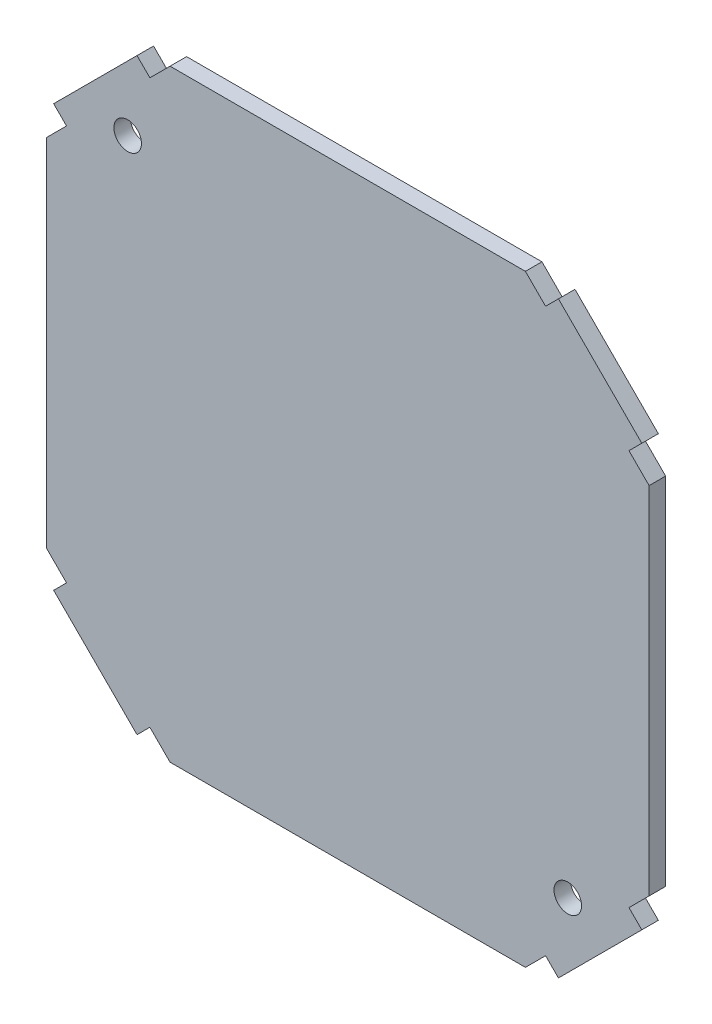
ISO-10303-21;
HEADER;
FILE_DESCRIPTION(('STEP AP214'),'2;1');
FILE_NAME('part.step','',(''),(''),'','','');
FILE_SCHEMA(('AUTOMOTIVE_DESIGN { 1 0 10303 214 1 1 1 1 }'));
ENDSEC;
DATA;
#1=APPLICATION_CONTEXT('core data for automotive mechanical design processes');
#2=APPLICATION_PROTOCOL_DEFINITION('international standard','automotive_design',2000,#1);
#3=PRODUCT_CONTEXT('',#1,'mechanical');
#4=PRODUCT('Part','Part','',(#3));
#5=PRODUCT_RELATED_PRODUCT_CATEGORY('part','',(#4));
#6=PRODUCT_DEFINITION_FORMATION('','',#4);
#7=PRODUCT_DEFINITION_CONTEXT('part definition',#1,'design');
#8=PRODUCT_DEFINITION('design','',#6,#7);
#9=PRODUCT_DEFINITION_SHAPE('','',#8);
#10=(LENGTH_UNIT() NAMED_UNIT(*) SI_UNIT(.MILLI.,.METRE.));
#11=(NAMED_UNIT(*) PLANE_ANGLE_UNIT() SI_UNIT($,.RADIAN.));
#12=(NAMED_UNIT(*) SI_UNIT($,.STERADIAN.) SOLID_ANGLE_UNIT());
#13=UNCERTAINTY_MEASURE_WITH_UNIT(LENGTH_MEASURE(1.E-05),#10,'distance_accuracy_value','');
#14=(GEOMETRIC_REPRESENTATION_CONTEXT(3) GLOBAL_UNCERTAINTY_ASSIGNED_CONTEXT((#13)) GLOBAL_UNIT_ASSIGNED_CONTEXT((#10,
#11,#12)) REPRESENTATION_CONTEXT('',''));
#15=CARTESIAN_POINT('',(0.,0.,0.));
#16=DIRECTION('',(0.,0.,1.));
#17=DIRECTION('',(1.,0.,0.));
#18=AXIS2_PLACEMENT_3D('',#15,#16,#17);
#19=CARTESIAN_POINT('',(-28.2067734002126,28.2067734002128,-154.714963723617));
#20=DIRECTION('',(-0.707106781186546,0.707106781186549,0.));
#21=DIRECTION('',(-0.707106781186549,-0.707106781186546,0.));
#22=AXIS2_PLACEMENT_3D('',#19,#20,#21);
#23=PLANE('',#22);
#24=DIRECTION('',(0.707106781186549,0.707106781186546,0.));
#25=VECTOR('',#24,1.);
#26=CARTESIAN_POINT('',(-28.2067734002126,28.2067734002128,0.));
#27=LINE('',#26,#25);
#28=CARTESIAN_POINT('',(-6.10109758405818,50.3124492163671,0.));
#29=VERTEX_POINT('',#28);
#30=CARTESIAN_POINT('',(-2.44129960941351,53.9722471910118,0.));
#31=VERTEX_POINT('',#30);
#32=EDGE_CURVE('E141',#29,#31,#27,.T.);
#33=ORIENTED_EDGE('',*,*,#32,.F.);
#34=DIRECTION('',(0.,0.,1.));
#35=VECTOR('',#34,1.);
#36=CARTESIAN_POINT('',(-6.10109758405818,50.3124492163671,-154.714963723617));
#37=LINE('',#36,#35);
#38=CARTESIAN_POINT('',(-6.10109758405818,50.3124492163671,3.));
#39=VERTEX_POINT('',#38);
#40=EDGE_CURVE('E316',#29,#39,#37,.T.);
#41=ORIENTED_EDGE('',*,*,#40,.T.);
#42=DIRECTION('',(-0.707106781186549,-0.707106781186546,0.));
#43=VECTOR('',#42,1.);
#44=CARTESIAN_POINT('',(-28.2067734002126,28.2067734002128,3.));
#45=LINE('',#44,#43);
#46=CARTESIAN_POINT('',(-2.44129960941351,53.9722471910118,3.));
#47=VERTEX_POINT('',#46);
#48=EDGE_CURVE('E310',#47,#39,#45,.T.);
#49=ORIENTED_EDGE('',*,*,#48,.F.);
#50=DIRECTION('',(0.,0.,1.));
#51=VECTOR('',#50,1.);
#52=CARTESIAN_POINT('',(-2.44129960941351,53.9722471910118,-154.714963723617));
#53=LINE('',#52,#51);
#54=EDGE_CURVE('E313',#31,#47,#53,.T.);
#55=ORIENTED_EDGE('',*,*,#54,.F.);
#56=EDGE_LOOP('',(#33,#41,#49,#55));
#57=FACE_BOUND('',#56,.T.);
#58=ADVANCED_FACE('F39',(#57),#23,.T.);
#59=CARTESIAN_POINT('',(0.,53.9722471910118,-154.714963723617));
#60=DIRECTION('',(0.,1.,0.));
#61=DIRECTION('',(-1.,0.,0.));
#62=AXIS2_PLACEMENT_3D('',#59,#60,#61);
#63=PLANE('',#62);
#64=DIRECTION('',(1.,0.,0.));
#65=VECTOR('',#64,1.);
#66=CARTESIAN_POINT('',(0.,53.9722471910118,0.));
#67=LINE('',#66,#65);
#68=CARTESIAN_POINT('',(62.0553382572235,53.9722471910117,0.));
#69=VERTEX_POINT('',#68);
#70=EDGE_CURVE('E348',#31,#69,#67,.T.);
#71=ORIENTED_EDGE('',*,*,#70,.F.);
#72=ORIENTED_EDGE('',*,*,#54,.T.);
#73=DIRECTION('',(-1.,0.,0.));
#74=VECTOR('',#73,1.);
#75=CARTESIAN_POINT('',(0.,53.9722471910118,3.));
#76=LINE('',#75,#74);
#77=CARTESIAN_POINT('',(62.0553382572235,53.9722471910117,3.));
#78=VERTEX_POINT('',#77);
#79=EDGE_CURVE('E238',#78,#47,#76,.T.);
#80=ORIENTED_EDGE('',*,*,#79,.F.);
#81=DIRECTION('',(0.,0.,1.));
#82=VECTOR('',#81,1.);
#83=CARTESIAN_POINT('',(62.0553382572235,53.9722471910117,-154.714963723617));
#84=LINE('',#83,#82);
#85=EDGE_CURVE('E315',#69,#78,#84,.T.);
#86=ORIENTED_EDGE('',*,*,#85,.F.);
#87=EDGE_LOOP('',(#71,#72,#80,#86));
#88=FACE_BOUND('',#87,.T.);
#89=ADVANCED_FACE('F406',(#88),#63,.T.);
#90=CARTESIAN_POINT('',(58.0137927241175,58.0137927241177,-154.714963723617));
#91=DIRECTION('',(0.707106781186546,0.707106781186549,0.));
#92=DIRECTION('',(-0.707106781186549,0.707106781186546,0.));
#93=AXIS2_PLACEMENT_3D('',#90,#91,#92);
#94=PLANE('',#93);
#95=DIRECTION('',(0.707106781186549,-0.707106781186546,0.));
#96=VECTOR('',#95,1.);
#97=CARTESIAN_POINT('',(58.0137927241175,58.0137927241177,0.));
#98=LINE('',#97,#96);
#99=CARTESIAN_POINT('',(65.7151362318668,50.3124492163724,0.));
#100=VERTEX_POINT('',#99);
#101=EDGE_CURVE('E350',#69,#100,#98,.T.);
#102=ORIENTED_EDGE('',*,*,#101,.F.);
#103=ORIENTED_EDGE('',*,*,#85,.T.);
#104=DIRECTION('',(-0.707106781186549,0.707106781186546,0.));
#105=VECTOR('',#104,1.);
#106=CARTESIAN_POINT('',(58.0137927241175,58.0137927241177,3.));
#107=LINE('',#106,#105);
#108=CARTESIAN_POINT('',(65.7151362318668,50.3124492163724,3.));
#109=VERTEX_POINT('',#108);
#110=EDGE_CURVE('E241',#109,#78,#107,.T.);
#111=ORIENTED_EDGE('',*,*,#110,.F.);
#112=DIRECTION('',(0.,0.,1.));
#113=VECTOR('',#112,1.);
#114=CARTESIAN_POINT('',(65.7151362318668,50.3124492163724,-154.714963723617));
#115=LINE('',#114,#113);
#116=EDGE_CURVE('E246',#100,#109,#115,.T.);
#117=ORIENTED_EDGE('',*,*,#116,.F.);
#118=EDGE_LOOP('',(#102,#103,#111,#117));
#119=FACE_BOUND('',#118,.T.);
#120=ADVANCED_FACE('F412',(#119),#94,.T.);
#121=CARTESIAN_POINT('',(7.70134350774698,-7.70134350774703,-154.714963723617));
#122=DIRECTION('',(0.707106781186546,-0.70710678118655,0.));
#123=DIRECTION('',(0.70710678118655,0.707106781186546,0.));
#124=AXIS2_PLACEMENT_3D('',#121,#122,#123);
#125=PLANE('',#124);
#126=DIRECTION('',(0.,0.,1.));
#127=VECTOR('',#126,1.);
#128=CARTESIAN_POINT('',(68.0485886097844,52.64590159429,-154.714963723617));
#129=LINE('',#128,#127);
#130=CARTESIAN_POINT('',(68.0485886097844,52.64590159429,0.));
#131=VERTEX_POINT('',#130);
#132=CARTESIAN_POINT('',(68.0485886097844,52.64590159429,3.));
#133=VERTEX_POINT('',#132);
#134=EDGE_CURVE('E251',#131,#133,#129,.T.);
#135=ORIENTED_EDGE('',*,*,#134,.F.);
#136=DIRECTION('',(-0.70710678118655,-0.707106781186546,0.));
#137=VECTOR('',#136,1.);
#138=CARTESIAN_POINT('',(7.70134350774698,-7.70134350774703,0.));
#139=LINE('',#138,#137);
#140=EDGE_CURVE('E318',#131,#100,#139,.T.);
#141=ORIENTED_EDGE('',*,*,#140,.T.);
#142=ORIENTED_EDGE('',*,*,#116,.T.);
#143=DIRECTION('',(0.70710678118655,0.707106781186546,0.));
#144=VECTOR('',#143,1.);
#145=CARTESIAN_POINT('',(7.70134350774698,-7.70134350774703,3.));
#146=LINE('',#145,#144);
#147=EDGE_CURVE('E242',#109,#133,#146,.T.);
#148=ORIENTED_EDGE('',*,*,#147,.T.);
#149=EDGE_LOOP('',(#135,#141,#142,#148));
#150=FACE_BOUND('',#149,.T.);
#151=ADVANCED_FACE('F416',(#150),#125,.F.);
#152=CARTESIAN_POINT('',(60.3472451020374,60.347245102037,-154.714963723617));
#153=DIRECTION('',(-0.70710678118655,-0.707106781186545,0.));
#154=DIRECTION('',(0.707106781186545,-0.70710678118655,0.));
#155=AXIS2_PLACEMENT_3D('',#152,#153,#154);
#156=PLANE('',#155);
#157=DIRECTION('',(0.,0.,1.));
#158=VECTOR('',#157,1.);
#159=CARTESIAN_POINT('',(83.1806737271765,37.5138164768978,-154.714963723617));
#160=LINE('',#159,#158);
#161=CARTESIAN_POINT('',(83.1806737271765,37.5138164768978,0.));
#162=VERTEX_POINT('',#161);
#163=CARTESIAN_POINT('',(83.1806737271765,37.5138164768978,3.));
#164=VERTEX_POINT('',#163);
#165=EDGE_CURVE('E256',#162,#164,#160,.T.);
#166=ORIENTED_EDGE('',*,*,#165,.F.);
#167=DIRECTION('',(-0.707106781186545,0.70710678118655,0.));
#168=VECTOR('',#167,1.);
#169=CARTESIAN_POINT('',(60.3472451020374,60.347245102037,0.));
#170=LINE('',#169,#168);
#171=EDGE_CURVE('E245',#162,#131,#170,.T.);
#172=ORIENTED_EDGE('',*,*,#171,.T.);
#173=ORIENTED_EDGE('',*,*,#134,.T.);
#174=DIRECTION('',(0.707106781186545,-0.70710678118655,0.));
#175=VECTOR('',#174,1.);
#176=CARTESIAN_POINT('',(60.3472451020374,60.347245102037,3.));
#177=LINE('',#176,#175);
#178=EDGE_CURVE('E247',#133,#164,#177,.T.);
#179=ORIENTED_EDGE('',*,*,#178,.T.);
#180=EDGE_LOOP('',(#166,#172,#173,#179));
#181=FACE_BOUND('',#180,.T.);
#182=ADVANCED_FACE('F420',(#181),#156,.F.);
#183=CARTESIAN_POINT('',(22.8334286251391,-22.8334286251392,-154.714963723617));
#184=DIRECTION('',(-0.707106781186546,0.70710678118655,0.));
#185=DIRECTION('',(-0.70710678118655,-0.707106781186546,0.));
#186=AXIS2_PLACEMENT_3D('',#183,#184,#185);
#187=PLANE('',#186);
#188=DIRECTION('',(0.,0.,1.));
#189=VECTOR('',#188,1.);
#190=CARTESIAN_POINT('',(80.8472213492589,35.1803640989803,-154.714963723617));
#191=LINE('',#190,#189);
#192=CARTESIAN_POINT('',(80.847221349257,35.1803640989783,0.));
#193=VERTEX_POINT('',#192);
#194=CARTESIAN_POINT('',(80.8472213492589,35.1803640989803,3.));
#195=VERTEX_POINT('',#194);
#196=EDGE_CURVE('E255',#193,#195,#191,.T.);
#197=ORIENTED_EDGE('',*,*,#196,.F.);
#198=DIRECTION('',(0.70710678118655,0.707106781186546,0.));
#199=VECTOR('',#198,1.);
#200=CARTESIAN_POINT('',(22.8334286251391,-22.8334286251392,0.));
#201=LINE('',#200,#199);
#202=EDGE_CURVE('E250',#193,#162,#201,.T.);
#203=ORIENTED_EDGE('',*,*,#202,.T.);
#204=ORIENTED_EDGE('',*,*,#165,.T.);
#205=DIRECTION('',(-0.70710678118655,-0.707106781186546,0.));
#206=VECTOR('',#205,1.);
#207=CARTESIAN_POINT('',(22.8334286251391,-22.8334286251392,3.));
#208=LINE('',#207,#206);
#209=EDGE_CURVE('E252',#164,#195,#208,.T.);
#210=ORIENTED_EDGE('',*,*,#209,.T.);
#211=EDGE_LOOP('',(#197,#203,#204,#210));
#212=FACE_BOUND('',#211,.T.);
#213=ADVANCED_FACE('F425',(#212),#187,.F.);
#214=DIRECTION('',(0.707106781186549,-0.707106781186546,0.));
#215=VECTOR('',#214,1.);
#216=CARTESIAN_POINT('',(58.0137927241175,58.0137927241177,0.));
#217=LINE('',#216,#215);
#218=CARTESIAN_POINT('',(84.507019323905,31.5205661243303,0.));
#219=VERTEX_POINT('',#218);
#220=EDGE_CURVE('E352',#193,#219,#217,.T.);
#221=ORIENTED_EDGE('',*,*,#220,.F.);
#222=ORIENTED_EDGE('',*,*,#196,.T.);
#223=CARTESIAN_POINT('',(84.507019323905,31.5205661243303,3.));
#224=VERTEX_POINT('',#223);
#225=EDGE_CURVE('E257',#224,#195,#107,.T.);
#226=ORIENTED_EDGE('',*,*,#225,.F.);
#227=DIRECTION('',(0.,0.,1.));
#228=VECTOR('',#227,1.);
#229=CARTESIAN_POINT('',(84.507019323905,31.5205661243303,-154.714963723617));
#230=LINE('',#229,#228);
#231=EDGE_CURVE('E323',#219,#224,#230,.T.);
#232=ORIENTED_EDGE('',*,*,#231,.F.);
#233=EDGE_LOOP('',(#221,#222,#226,#232));
#234=FACE_BOUND('',#233,.T.);
#235=ADVANCED_FACE('F429',(#234),#94,.T.);
#236=CARTESIAN_POINT('',(84.507019323905,0.,-154.714963723617));
#237=DIRECTION('',(1.,0.,0.));
#238=DIRECTION('',(0.,0.,-1.));
#239=AXIS2_PLACEMENT_3D('',#236,#237,#238);
#240=PLANE('',#239);
#241=DIRECTION('',(0.,-1.,0.));
#242=VECTOR('',#241,1.);
#243=CARTESIAN_POINT('',(84.507019323905,0.,0.));
#244=LINE('',#243,#242);
#245=CARTESIAN_POINT('',(84.507019323905,-32.9760717423068,0.));
#246=VERTEX_POINT('',#245);
#247=EDGE_CURVE('E360',#219,#246,#244,.T.);
#248=ORIENTED_EDGE('',*,*,#247,.F.);
#249=ORIENTED_EDGE('',*,*,#231,.T.);
#250=DIRECTION('',(0.,1.,0.));
#251=VECTOR('',#250,1.);
#252=CARTESIAN_POINT('',(84.507019323905,0.,3.));
#253=LINE('',#252,#251);
#254=CARTESIAN_POINT('',(84.507019323905,-32.9760717423068,3.));
#255=VERTEX_POINT('',#254);
#256=EDGE_CURVE('E260',#255,#224,#253,.T.);
#257=ORIENTED_EDGE('',*,*,#256,.F.);
#258=DIRECTION('',(0.,0.,1.));
#259=VECTOR('',#258,1.);
#260=CARTESIAN_POINT('',(84.507019323905,-32.9760717423068,-154.714963723617));
#261=LINE('',#260,#259);
#262=EDGE_CURVE('E325',#246,#255,#261,.T.);
#263=ORIENTED_EDGE('',*,*,#262,.F.);
#264=EDGE_LOOP('',(#248,#249,#257,#263));
#265=FACE_BOUND('',#264,.T.);
#266=ADVANCED_FACE('F434',(#265),#240,.T.);
#267=CARTESIAN_POINT('',(58.7415455331057,-58.7415455331059,-154.714963723617));
#268=DIRECTION('',(0.707106781186546,-0.707106781186549,0.));
#269=DIRECTION('',(0.707106781186549,0.707106781186546,0.));
#270=AXIS2_PLACEMENT_3D('',#267,#268,#269);
#271=PLANE('',#270);
#272=DIRECTION('',(-0.707106781186549,-0.707106781186546,0.));
#273=VECTOR('',#272,1.);
#274=CARTESIAN_POINT('',(58.7415455331057,-58.7415455331059,0.));
#275=LINE('',#274,#273);
#276=CARTESIAN_POINT('',(80.8472213492677,-36.6358697169445,0.));
#277=VERTEX_POINT('',#276);
#278=EDGE_CURVE('E362',#246,#277,#275,.T.);
#279=ORIENTED_EDGE('',*,*,#278,.F.);
#280=ORIENTED_EDGE('',*,*,#262,.T.);
#281=DIRECTION('',(0.707106781186549,0.707106781186546,0.));
#282=VECTOR('',#281,1.);
#283=CARTESIAN_POINT('',(58.7415455331057,-58.7415455331059,3.));
#284=LINE('',#283,#282);
#285=CARTESIAN_POINT('',(80.8472213492677,-36.6358697169445,3.));
#286=VERTEX_POINT('',#285);
#287=EDGE_CURVE('E263',#286,#255,#284,.T.);
#288=ORIENTED_EDGE('',*,*,#287,.F.);
#289=DIRECTION('',(0.,0.,1.));
#290=VECTOR('',#289,1.);
#291=CARTESIAN_POINT('',(80.8472213492677,-36.6358697169445,-154.714963723617));
#292=LINE('',#291,#290);
#293=EDGE_CURVE('E268',#277,#286,#292,.T.);
#294=ORIENTED_EDGE('',*,*,#293,.F.);
#295=EDGE_LOOP('',(#279,#280,#288,#294));
#296=FACE_BOUND('',#295,.T.);
#297=ADVANCED_FACE('F440',(#296),#271,.T.);
#298=CARTESIAN_POINT('',(22.1056758161625,22.105675816162,-154.714963723617));
#299=DIRECTION('',(-0.707106781186555,-0.70710678118654,0.));
#300=DIRECTION('',(0.70710678118654,-0.707106781186555,0.));
#301=AXIS2_PLACEMENT_3D('',#298,#299,#300);
#302=PLANE('',#301);
#303=DIRECTION('',(0.,0.,1.));
#304=VECTOR('',#303,1.);
#305=CARTESIAN_POINT('',(83.1806737271835,-38.9693220948604,-154.714963723617));
#306=LINE('',#305,#304);
#307=CARTESIAN_POINT('',(83.1806737271835,-38.9693220948604,0.));
#308=VERTEX_POINT('',#307);
#309=CARTESIAN_POINT('',(83.1806737271835,-38.9693220948604,3.));
#310=VERTEX_POINT('',#309);
#311=EDGE_CURVE('E273',#308,#310,#306,.T.);
#312=ORIENTED_EDGE('',*,*,#311,.F.);
#313=DIRECTION('',(-0.70710678118654,0.707106781186555,0.));
#314=VECTOR('',#313,1.);
#315=CARTESIAN_POINT('',(22.1056758161625,22.105675816162,0.));
#316=LINE('',#315,#314);
#317=EDGE_CURVE('E327',#308,#277,#316,.T.);
#318=ORIENTED_EDGE('',*,*,#317,.T.);
#319=ORIENTED_EDGE('',*,*,#293,.T.);
#320=DIRECTION('',(0.70710678118654,-0.707106781186555,0.));
#321=VECTOR('',#320,1.);
#322=CARTESIAN_POINT('',(22.1056758161625,22.105675816162,3.));
#323=LINE('',#322,#321);
#324=EDGE_CURVE('E264',#286,#310,#323,.T.);
#325=ORIENTED_EDGE('',*,*,#324,.T.);
#326=EDGE_LOOP('',(#312,#318,#319,#325));
#327=FACE_BOUND('',#326,.T.);
#328=ADVANCED_FACE('F444',(#327),#302,.F.);
#329=CARTESIAN_POINT('',(61.0749979110214,-61.0749979110222,-154.714963723617));
#330=DIRECTION('',(-0.707106781186543,0.707106781186553,0.));
#331=DIRECTION('',(-0.707106781186553,-0.707106781186543,0.));
#332=AXIS2_PLACEMENT_3D('',#329,#330,#331);
#333=PLANE('',#332);
#334=DIRECTION('',(0.,0.,1.));
#335=VECTOR('',#334,1.);
#336=CARTESIAN_POINT('',(68.0485886097913,-54.1014072122524,-154.714963723617));
#337=LINE('',#336,#335);
#338=CARTESIAN_POINT('',(68.0485886097913,-54.1014072122524,0.));
#339=VERTEX_POINT('',#338);
#340=CARTESIAN_POINT('',(68.0485886097913,-54.1014072122524,3.));
#341=VERTEX_POINT('',#340);
#342=EDGE_CURVE('E278',#339,#341,#337,.T.);
#343=ORIENTED_EDGE('',*,*,#342,.F.);
#344=DIRECTION('',(0.707106781186553,0.707106781186543,0.));
#345=VECTOR('',#344,1.);
#346=CARTESIAN_POINT('',(61.0749979110214,-61.0749979110222,0.));
#347=LINE('',#346,#345);
#348=EDGE_CURVE('E267',#339,#308,#347,.T.);
#349=ORIENTED_EDGE('',*,*,#348,.T.);
#350=ORIENTED_EDGE('',*,*,#311,.T.);
#351=DIRECTION('',(-0.707106781186553,-0.707106781186543,0.));
#352=VECTOR('',#351,1.);
#353=CARTESIAN_POINT('',(61.0749979110214,-61.0749979110222,3.));
#354=LINE('',#353,#352);
#355=EDGE_CURVE('E269',#310,#341,#354,.T.);
#356=ORIENTED_EDGE('',*,*,#355,.T.);
#357=EDGE_LOOP('',(#343,#349,#350,#356));
#358=FACE_BOUND('',#357,.T.);
#359=ADVANCED_FACE('F448',(#358),#333,.F.);
#360=CARTESIAN_POINT('',(6.97359069876996,6.97359069876985,-154.714963723617));
#361=DIRECTION('',(0.707106781186553,0.707106781186542,0.));
#362=DIRECTION('',(-0.707106781186542,0.707106781186553,0.));
#363=AXIS2_PLACEMENT_3D('',#360,#361,#362);
#364=PLANE('',#363);
#365=DIRECTION('',(0.,0.,1.));
#366=VECTOR('',#365,1.);
#367=CARTESIAN_POINT('',(65.7151362318755,-51.7679548343366,-154.714963723617));
#368=LINE('',#367,#366);
#369=CARTESIAN_POINT('',(65.7151362318753,-51.7679548343364,0.));
#370=VERTEX_POINT('',#369);
#371=CARTESIAN_POINT('',(65.7151362318755,-51.7679548343366,3.));
#372=VERTEX_POINT('',#371);
#373=EDGE_CURVE('E277',#370,#372,#368,.T.);
#374=ORIENTED_EDGE('',*,*,#373,.F.);
#375=DIRECTION('',(0.707106781186542,-0.707106781186553,0.));
#376=VECTOR('',#375,1.);
#377=CARTESIAN_POINT('',(6.97359069876996,6.97359069876985,0.));
#378=LINE('',#377,#376);
#379=EDGE_CURVE('E272',#370,#339,#378,.T.);
#380=ORIENTED_EDGE('',*,*,#379,.T.);
#381=ORIENTED_EDGE('',*,*,#342,.T.);
#382=DIRECTION('',(-0.707106781186542,0.707106781186553,0.));
#383=VECTOR('',#382,1.);
#384=CARTESIAN_POINT('',(6.97359069876996,6.97359069876985,3.));
#385=LINE('',#384,#383);
#386=EDGE_CURVE('E274',#341,#372,#385,.T.);
#387=ORIENTED_EDGE('',*,*,#386,.T.);
#388=EDGE_LOOP('',(#374,#380,#381,#387));
#389=FACE_BOUND('',#388,.T.);
#390=ADVANCED_FACE('F453',(#389),#364,.F.);
#391=DIRECTION('',(-0.707106781186549,-0.707106781186546,0.));
#392=VECTOR('',#391,1.);
#393=CARTESIAN_POINT('',(58.7415455331057,-58.7415455331059,0.));
#394=LINE('',#393,#392);
#395=CARTESIAN_POINT('',(62.0553382572234,-55.4277528089882,0.));
#396=VERTEX_POINT('',#395);
#397=EDGE_CURVE('E364',#370,#396,#394,.T.);
#398=ORIENTED_EDGE('',*,*,#397,.F.);
#399=ORIENTED_EDGE('',*,*,#373,.T.);
#400=CARTESIAN_POINT('',(62.0553382572234,-55.4277528089882,3.));
#401=VERTEX_POINT('',#400);
#402=EDGE_CURVE('E279',#401,#372,#284,.T.);
#403=ORIENTED_EDGE('',*,*,#402,.F.);
#404=DIRECTION('',(0.,0.,1.));
#405=VECTOR('',#404,1.);
#406=CARTESIAN_POINT('',(62.0553382572234,-55.4277528089882,-154.714963723617));
#407=LINE('',#406,#405);
#408=EDGE_CURVE('E332',#396,#401,#407,.T.);
#409=ORIENTED_EDGE('',*,*,#408,.F.);
#410=EDGE_LOOP('',(#398,#399,#403,#409));
#411=FACE_BOUND('',#410,.T.);
#412=ADVANCED_FACE('F457',(#411),#271,.T.);
#413=CARTESIAN_POINT('',(0.,-55.4277528089882,-154.714963723617));
#414=DIRECTION('',(0.,-1.,0.));
#415=DIRECTION('',(0.,0.,-1.));
#416=AXIS2_PLACEMENT_3D('',#413,#414,#415);
#417=PLANE('',#416);
#418=DIRECTION('',(-1.,0.,0.));
#419=VECTOR('',#418,1.);
#420=CARTESIAN_POINT('',(0.,-55.4277528089882,0.));
#421=LINE('',#420,#419);
#422=CARTESIAN_POINT('',(-2.44129960941351,-55.4277528089882,0.));
#423=VERTEX_POINT('',#422);
#424=EDGE_CURVE('E372',#396,#423,#421,.T.);
#425=ORIENTED_EDGE('',*,*,#424,.F.);
#426=ORIENTED_EDGE('',*,*,#408,.T.);
#427=DIRECTION('',(1.,0.,0.));
#428=VECTOR('',#427,1.);
#429=CARTESIAN_POINT('',(0.,-55.4277528089882,3.));
#430=LINE('',#429,#428);
#431=CARTESIAN_POINT('',(-2.44129960941351,-55.4277528089882,3.));
#432=VERTEX_POINT('',#431);
#433=EDGE_CURVE('E282',#432,#401,#430,.T.);
#434=ORIENTED_EDGE('',*,*,#433,.F.);
#435=DIRECTION('',(0.,0.,1.));
#436=VECTOR('',#435,1.);
#437=CARTESIAN_POINT('',(-2.44129960941351,-55.4277528089882,-154.714963723617));
#438=LINE('',#437,#436);
#439=EDGE_CURVE('E334',#423,#432,#438,.T.);
#440=ORIENTED_EDGE('',*,*,#439,.F.);
#441=EDGE_LOOP('',(#425,#426,#434,#440));
#442=FACE_BOUND('',#441,.T.);
#443=ADVANCED_FACE('F462',(#442),#417,.T.);
#444=CARTESIAN_POINT('',(-28.9345262092009,-28.934526209201,-154.714963723617));
#445=DIRECTION('',(-0.707106781186546,-0.707106781186549,0.));
#446=DIRECTION('',(0.707106781186549,-0.707106781186546,0.));
#447=AXIS2_PLACEMENT_3D('',#444,#445,#446);
#448=PLANE('',#447);
#449=DIRECTION('',(-0.707106781186549,0.707106781186546,0.));
#450=VECTOR('',#449,1.);
#451=CARTESIAN_POINT('',(-28.9345262092009,-28.934526209201,0.));
#452=LINE('',#451,#450);
#453=CARTESIAN_POINT('',(-6.10109758405125,-51.7679548343436,0.));
#454=VERTEX_POINT('',#453);
#455=EDGE_CURVE('E374',#423,#454,#452,.T.);
#456=ORIENTED_EDGE('',*,*,#455,.F.);
#457=ORIENTED_EDGE('',*,*,#439,.T.);
#458=DIRECTION('',(0.707106781186549,-0.707106781186546,0.));
#459=VECTOR('',#458,1.);
#460=CARTESIAN_POINT('',(-28.9345262092009,-28.934526209201,3.));
#461=LINE('',#460,#459);
#462=CARTESIAN_POINT('',(-6.10109758405297,-51.7679548343453,3.));
#463=VERTEX_POINT('',#462);
#464=EDGE_CURVE('E285',#463,#432,#461,.T.);
#465=ORIENTED_EDGE('',*,*,#464,.F.);
#466=DIRECTION('',(0.,0.,1.));
#467=VECTOR('',#466,1.);
#468=CARTESIAN_POINT('',(-6.10109758405297,-51.7679548343453,-154.714963723617));
#469=LINE('',#468,#467);
#470=EDGE_CURVE('E290',#454,#463,#469,.T.);
#471=ORIENTED_EDGE('',*,*,#470,.F.);
#472=EDGE_LOOP('',(#456,#457,#465,#471));
#473=FACE_BOUND('',#472,.T.);
#474=ADVANCED_FACE('F468',(#473),#448,.T.);
#475=CARTESIAN_POINT('',(22.8334286251463,-22.8334286251468,-154.714963723617));
#476=DIRECTION('',(-0.707106781186539,0.707106781186556,0.));
#477=DIRECTION('',(-0.707106781186556,-0.707106781186539,0.));
#478=AXIS2_PLACEMENT_3D('',#475,#476,#477);
#479=PLANE('',#478);
#480=DIRECTION('',(0.,0.,1.));
#481=VECTOR('',#480,1.);
#482=CARTESIAN_POINT('',(-8.43454996196689,-54.1014072122592,-154.714963723617));
#483=LINE('',#482,#481);
#484=CARTESIAN_POINT('',(-8.43454996196689,-54.1014072122592,0.));
#485=VERTEX_POINT('',#484);
#486=CARTESIAN_POINT('',(-8.43454996196689,-54.1014072122592,3.));
#487=VERTEX_POINT('',#486);
#488=EDGE_CURVE('E295',#485,#487,#483,.T.);
#489=ORIENTED_EDGE('',*,*,#488,.F.);
#490=DIRECTION('',(0.707106781186556,0.707106781186539,0.));
#491=VECTOR('',#490,1.);
#492=CARTESIAN_POINT('',(22.8334286251463,-22.8334286251468,0.));
#493=LINE('',#492,#491);
#494=EDGE_CURVE('E336',#485,#454,#493,.T.);
#495=ORIENTED_EDGE('',*,*,#494,.T.);
#496=ORIENTED_EDGE('',*,*,#470,.T.);
#497=DIRECTION('',(-0.707106781186556,-0.707106781186539,0.));
#498=VECTOR('',#497,1.);
#499=CARTESIAN_POINT('',(22.8334286251463,-22.8334286251468,3.));
#500=LINE('',#499,#498);
#501=EDGE_CURVE('E286',#463,#487,#500,.T.);
#502=ORIENTED_EDGE('',*,*,#501,.T.);
#503=EDGE_LOOP('',(#489,#495,#496,#502));
#504=FACE_BOUND('',#503,.T.);
#505=ADVANCED_FACE('F472',(#504),#479,.F.);
#506=CARTESIAN_POINT('',(-31.2679785871131,-31.2679785871125,-154.714963723617));
#507=DIRECTION('',(0.707106781186555,0.70710678118654,0.));
#508=DIRECTION('',(-0.70710678118654,0.707106781186555,0.));
#509=AXIS2_PLACEMENT_3D('',#506,#507,#508);
#510=PLANE('',#509);
#511=DIRECTION('',(0.,0.,1.));
#512=VECTOR('',#511,1.);
#513=CARTESIAN_POINT('',(-23.5666350793589,-38.9693220948669,-154.714963723617));
#514=LINE('',#513,#512);
#515=CARTESIAN_POINT('',(-23.5666350793589,-38.9693220948669,0.));
#516=VERTEX_POINT('',#515);
#517=CARTESIAN_POINT('',(-23.5666350793589,-38.9693220948669,3.));
#518=VERTEX_POINT('',#517);
#519=EDGE_CURVE('E300',#516,#518,#514,.T.);
#520=ORIENTED_EDGE('',*,*,#519,.F.);
#521=DIRECTION('',(0.70710678118654,-0.707106781186555,0.));
#522=VECTOR('',#521,1.);
#523=CARTESIAN_POINT('',(-31.2679785871131,-31.2679785871125,0.));
#524=LINE('',#523,#522);
#525=EDGE_CURVE('E289',#516,#485,#524,.T.);
#526=ORIENTED_EDGE('',*,*,#525,.T.);
#527=ORIENTED_EDGE('',*,*,#488,.T.);
#528=DIRECTION('',(-0.70710678118654,0.707106781186555,0.));
#529=VECTOR('',#528,1.);
#530=CARTESIAN_POINT('',(-31.2679785871131,-31.2679785871125,3.));
#531=LINE('',#530,#529);
#532=EDGE_CURVE('E291',#487,#518,#531,.T.);
#533=ORIENTED_EDGE('',*,*,#532,.T.);
#534=EDGE_LOOP('',(#520,#526,#527,#533));
#535=FACE_BOUND('',#534,.T.);
#536=ADVANCED_FACE('F476',(#535),#510,.F.);
#537=CARTESIAN_POINT('',(7.70134350775425,-7.70134350775441,-154.714963723617));
#538=DIRECTION('',(0.70710678118654,-0.707106781186555,0.));
#539=DIRECTION('',(0.707106781186555,0.70710678118654,0.));
#540=AXIS2_PLACEMENT_3D('',#537,#538,#539);
#541=PLANE('',#540);
#542=DIRECTION('',(0.,0.,1.));
#543=VECTOR('',#542,1.);
#544=CARTESIAN_POINT('',(-21.2331827014451,-36.6358697169531,-154.714963723617));
#545=LINE('',#544,#543);
#546=CARTESIAN_POINT('',(-21.2331827014469,-36.6358697169549,0.));
#547=VERTEX_POINT('',#546);
#548=CARTESIAN_POINT('',(-21.2331827014451,-36.6358697169531,3.));
#549=VERTEX_POINT('',#548);
#550=EDGE_CURVE('E299',#547,#549,#545,.T.);
#551=ORIENTED_EDGE('',*,*,#550,.F.);
#552=DIRECTION('',(-0.707106781186555,-0.70710678118654,0.));
#553=VECTOR('',#552,1.);
#554=CARTESIAN_POINT('',(7.70134350775425,-7.70134350775441,0.));
#555=LINE('',#554,#553);
#556=EDGE_CURVE('E294',#547,#516,#555,.T.);
#557=ORIENTED_EDGE('',*,*,#556,.T.);
#558=ORIENTED_EDGE('',*,*,#519,.T.);
#559=DIRECTION('',(0.707106781186555,0.70710678118654,0.));
#560=VECTOR('',#559,1.);
#561=CARTESIAN_POINT('',(7.70134350775425,-7.70134350775441,3.));
#562=LINE('',#561,#560);
#563=EDGE_CURVE('E296',#518,#549,#562,.T.);
#564=ORIENTED_EDGE('',*,*,#563,.T.);
#565=EDGE_LOOP('',(#551,#557,#558,#564));
#566=FACE_BOUND('',#565,.T.);
#567=ADVANCED_FACE('F479',(#566),#541,.F.);
#568=DIRECTION('',(-0.707106781186549,0.707106781186546,0.));
#569=VECTOR('',#568,1.);
#570=CARTESIAN_POINT('',(-28.9345262092009,-28.934526209201,0.));
#571=LINE('',#570,#569);
#572=CARTESIAN_POINT('',(-24.892980676095,-32.9760717423068,0.));
#573=VERTEX_POINT('',#572);
#574=EDGE_CURVE('E376',#547,#573,#571,.T.);
#575=ORIENTED_EDGE('',*,*,#574,.F.);
#576=ORIENTED_EDGE('',*,*,#550,.T.);
#577=CARTESIAN_POINT('',(-24.892980676095,-32.9760717423068,3.));
#578=VERTEX_POINT('',#577);
#579=EDGE_CURVE('E301',#578,#549,#461,.T.);
#580=ORIENTED_EDGE('',*,*,#579,.F.);
#581=DIRECTION('',(0.,0.,1.));
#582=VECTOR('',#581,1.);
#583=CARTESIAN_POINT('',(-24.892980676095,-32.9760717423068,-154.714963723617));
#584=LINE('',#583,#582);
#585=EDGE_CURVE('E341',#573,#578,#584,.T.);
#586=ORIENTED_EDGE('',*,*,#585,.F.);
#587=EDGE_LOOP('',(#575,#576,#580,#586));
#588=FACE_BOUND('',#587,.T.);
#589=ADVANCED_FACE('F483',(#588),#448,.T.);
#590=CARTESIAN_POINT('',(-24.892980676095,0.,-154.714963723617));
#591=DIRECTION('',(-1.,0.,0.));
#592=DIRECTION('',(0.,0.,1.));
#593=AXIS2_PLACEMENT_3D('',#590,#591,#592);
#594=PLANE('',#593);
#595=DIRECTION('',(0.,1.,0.));
#596=VECTOR('',#595,1.);
#597=CARTESIAN_POINT('',(-24.892980676095,0.,0.));
#598=LINE('',#597,#596);
#599=CARTESIAN_POINT('',(-24.892980676095,31.5205661243303,0.));
#600=VERTEX_POINT('',#599);
#601=EDGE_CURVE('E49',#573,#600,#598,.T.);
#602=ORIENTED_EDGE('',*,*,#601,.F.);
#603=ORIENTED_EDGE('',*,*,#585,.T.);
#604=DIRECTION('',(0.,-1.,0.));
#605=VECTOR('',#604,1.);
#606=CARTESIAN_POINT('',(-24.892980676095,0.,3.));
#607=LINE('',#606,#605);
#608=CARTESIAN_POINT('',(-24.892980676095,31.5205661243303,3.));
#609=VERTEX_POINT('',#608);
#610=EDGE_CURVE('E304',#609,#578,#607,.T.);
#611=ORIENTED_EDGE('',*,*,#610,.F.);
#612=DIRECTION('',(0.,0.,1.));
#613=VECTOR('',#612,1.);
#614=CARTESIAN_POINT('',(-24.892980676095,31.5205661243303,-154.714963723617));
#615=LINE('',#614,#613);
#616=EDGE_CURVE('E210',#600,#609,#615,.T.);
#617=ORIENTED_EDGE('',*,*,#616,.F.);
#618=EDGE_LOOP('',(#602,#603,#611,#617));
#619=FACE_BOUND('',#618,.T.);
#620=ADVANCED_FACE('F390',(#619),#594,.T.);
#621=DIRECTION('',(0.707106781186549,0.707106781186546,0.));
#622=VECTOR('',#621,1.);
#623=CARTESIAN_POINT('',(-28.2067734002126,28.2067734002128,0.));
#624=LINE('',#623,#622);
#625=CARTESIAN_POINT('',(-21.2331827014503,35.1803640989749,0.));
#626=VERTEX_POINT('',#625);
#627=EDGE_CURVE('E11',#600,#626,#624,.T.);
#628=ORIENTED_EDGE('',*,*,#627,.F.);
#629=ORIENTED_EDGE('',*,*,#616,.T.);
#630=CARTESIAN_POINT('',(-21.2331827014503,35.180364098975,3.));
#631=VERTEX_POINT('',#630);
#632=EDGE_CURVE('E306',#631,#609,#45,.T.);
#633=ORIENTED_EDGE('',*,*,#632,.F.);
#634=DIRECTION('',(0.,0.,1.));
#635=VECTOR('',#634,1.);
#636=CARTESIAN_POINT('',(-21.2331827014503,35.180364098975,-154.714963723617));
#637=LINE('',#636,#635);
#638=EDGE_CURVE('E209',#626,#631,#637,.T.);
#639=ORIENTED_EDGE('',*,*,#638,.F.);
#640=EDGE_LOOP('',(#628,#629,#633,#639));
#641=FACE_BOUND('',#640,.T.);
#642=ADVANCED_FACE('F394',(#641),#23,.T.);
#643=CARTESIAN_POINT('',(6.97359069876231,6.97359069876231,-154.714963723617));
#644=DIRECTION('',(0.707106781186548,0.707106781186548,0.));
#645=DIRECTION('',(-0.707106781186548,0.707106781186548,0.));
#646=AXIS2_PLACEMENT_3D('',#643,#644,#645);
#647=PLANE('',#646);
#648=DIRECTION('',(0.,0.,1.));
#649=VECTOR('',#648,1.);
#650=CARTESIAN_POINT('',(-23.5666350793659,37.5138164768906,-154.714963723617));
#651=LINE('',#650,#649);
#652=CARTESIAN_POINT('',(-23.5666350793659,37.5138164768906,0.));
#653=VERTEX_POINT('',#652);
#654=CARTESIAN_POINT('',(-23.5666350793659,37.5138164768906,3.));
#655=VERTEX_POINT('',#654);
#656=EDGE_CURVE('E213',#653,#655,#651,.T.);
#657=ORIENTED_EDGE('',*,*,#656,.F.);
#658=DIRECTION('',(0.707106781186548,-0.707106781186548,0.));
#659=VECTOR('',#658,1.);
#660=CARTESIAN_POINT('',(6.97359069876231,6.97359069876231,0.));
#661=LINE('',#660,#659);
#662=EDGE_CURVE('E203',#653,#626,#661,.T.);
#663=ORIENTED_EDGE('',*,*,#662,.T.);
#664=ORIENTED_EDGE('',*,*,#638,.T.);
#665=DIRECTION('',(-0.707106781186548,0.707106781186548,0.));
#666=VECTOR('',#665,1.);
#667=CARTESIAN_POINT('',(6.97359069876231,6.97359069876231,3.));
#668=LINE('',#667,#666);
#669=EDGE_CURVE('E216',#631,#655,#668,.T.);
#670=ORIENTED_EDGE('',*,*,#669,.T.);
#671=EDGE_LOOP('',(#657,#663,#664,#670));
#672=FACE_BOUND('',#671,.T.);
#673=ADVANCED_FACE('F214',(#672),#647,.F.);
#674=CARTESIAN_POINT('',(-30.5402257781282,30.5402257781283,-154.714963723617));
#675=DIRECTION('',(0.707106781186547,-0.707106781186548,0.));
#676=DIRECTION('',(0.707106781186548,0.707106781186547,0.));
#677=AXIS2_PLACEMENT_3D('',#674,#675,#676);
#678=PLANE('',#677);
#679=DIRECTION('',(0.,0.,1.));
#680=VECTOR('',#679,1.);
#681=CARTESIAN_POINT('',(-8.43454996197379,52.6459015942827,-154.714963723617));
#682=LINE('',#681,#680);
#683=CARTESIAN_POINT('',(-8.43454996197379,52.6459015942827,0.));
#684=VERTEX_POINT('',#683);
#685=CARTESIAN_POINT('',(-8.43454996197379,52.6459015942827,3.));
#686=VERTEX_POINT('',#685);
#687=EDGE_CURVE('E136',#684,#686,#682,.T.);
#688=ORIENTED_EDGE('',*,*,#687,.F.);
#689=DIRECTION('',(-0.707106781186548,-0.707106781186547,0.));
#690=VECTOR('',#689,1.);
#691=CARTESIAN_POINT('',(-30.5402257781282,30.5402257781283,0.));
#692=LINE('',#691,#690);
#693=EDGE_CURVE('E207',#684,#653,#692,.T.);
#694=ORIENTED_EDGE('',*,*,#693,.T.);
#695=ORIENTED_EDGE('',*,*,#656,.T.);
#696=DIRECTION('',(0.707106781186548,0.707106781186547,0.));
#697=VECTOR('',#696,1.);
#698=CARTESIAN_POINT('',(-30.5402257781282,30.5402257781283,3.));
#699=LINE('',#698,#697);
#700=EDGE_CURVE('E219',#655,#686,#699,.T.);
#701=ORIENTED_EDGE('',*,*,#700,.T.);
#702=EDGE_LOOP('',(#688,#694,#695,#701));
#703=FACE_BOUND('',#702,.T.);
#704=ADVANCED_FACE('F221',(#703),#678,.F.);
#705=CARTESIAN_POINT('',(-10.1316062368216,39.2108727517383,-154.714963723617));
#706=DIRECTION('',(0.,0.,1.));
#707=DIRECTION('',(1.,0.,0.));
#708=AXIS2_PLACEMENT_3D('',#705,#706,#707);
#709=CYLINDRICAL_SURFACE('',#708,2.5);
#710=CARTESIAN_POINT('',(-10.1316062368216,39.2108727517383,0.));
#711=DIRECTION('',(0.,0.,1.));
#712=DIRECTION('',(1.,0.,0.));
#713=AXIS2_PLACEMENT_3D('',#710,#711,#712);
#714=CIRCLE('',#713,2.5);
#715=CARTESIAN_POINT('',(-7.63160623682159,39.2108727517383,0.));
#716=VERTEX_POINT('',#715);
#717=EDGE_CURVE('E229',#716,#716,#714,.F.);
#718=ORIENTED_EDGE('',*,*,#717,.T.);
#719=EDGE_LOOP('',(#718));
#720=FACE_BOUND('',#719,.T.);
#721=CARTESIAN_POINT('',(-10.1316062368216,39.2108727517383,3.));
#722=DIRECTION('',(0.,0.,1.));
#723=DIRECTION('',(1.,0.,0.));
#724=AXIS2_PLACEMENT_3D('',#721,#722,#723);
#725=CIRCLE('',#724,2.5);
#726=CARTESIAN_POINT('',(-7.63160623682159,39.2108727517383,3.));
#727=VERTEX_POINT('',#726);
#728=EDGE_CURVE('E224',#727,#727,#725,.T.);
#729=ORIENTED_EDGE('',*,*,#728,.T.);
#730=EDGE_LOOP('',(#729));
#731=FACE_BOUND('',#730,.T.);
#732=ADVANCED_FACE('F507',(#720,#731),#709,.F.);
#733=CARTESIAN_POINT('',(22.1056758161545,22.1056758161545,-154.714963723617));
#734=DIRECTION('',(-0.707106781186547,-0.707106781186548,0.));
#735=DIRECTION('',(0.707106781186548,-0.707106781186547,0.));
#736=AXIS2_PLACEMENT_3D('',#733,#734,#735);
#737=PLANE('',#736);
#738=ORIENTED_EDGE('',*,*,#40,.F.);
#739=DIRECTION('',(-0.707106781186548,0.707106781186547,0.));
#740=VECTOR('',#739,1.);
#741=CARTESIAN_POINT('',(22.1056758161545,22.1056758161545,0.));
#742=LINE('',#741,#740);
#743=EDGE_CURVE('E58',#29,#684,#742,.T.);
#744=ORIENTED_EDGE('',*,*,#743,.T.);
#745=ORIENTED_EDGE('',*,*,#687,.T.);
#746=DIRECTION('',(0.707106781186548,-0.707106781186547,0.));
#747=VECTOR('',#746,1.);
#748=CARTESIAN_POINT('',(22.1056758161545,22.1056758161545,3.));
#749=LINE('',#748,#747);
#750=EDGE_CURVE('E226',#686,#39,#749,.T.);
#751=ORIENTED_EDGE('',*,*,#750,.T.);
#752=EDGE_LOOP('',(#738,#744,#745,#751));
#753=FACE_BOUND('',#752,.T.);
#754=ADVANCED_FACE('F400',(#753),#737,.F.);
#755=CARTESIAN_POINT('',(69.7456448846316,-40.6663783697148,-154.714963723617));
#756=DIRECTION('',(0.,0.,1.));
#757=DIRECTION('',(1.,0.,0.));
#758=AXIS2_PLACEMENT_3D('',#755,#756,#757);
#759=CYLINDRICAL_SURFACE('',#758,2.50000000000001);
#760=CARTESIAN_POINT('',(69.7456448846316,-40.6663783697148,0.));
#761=DIRECTION('',(0.,0.,1.));
#762=DIRECTION('',(1.,0.,0.));
#763=AXIS2_PLACEMENT_3D('',#760,#761,#762);
#764=CIRCLE('',#763,2.50000000000001);
#765=CARTESIAN_POINT('',(72.2456448846316,-40.6663783697148,0.));
#766=VERTEX_POINT('',#765);
#767=EDGE_CURVE('E43',#766,#766,#764,.T.);
#768=ORIENTED_EDGE('',*,*,#767,.F.);
#769=EDGE_LOOP('',(#768));
#770=FACE_BOUND('',#769,.T.);
#771=CARTESIAN_POINT('',(69.7456448846316,-40.6663783697148,3.));
#772=DIRECTION('',(0.,0.,1.));
#773=DIRECTION('',(1.,0.,0.));
#774=AXIS2_PLACEMENT_3D('',#771,#772,#773);
#775=CIRCLE('',#774,2.50000000000001);
#776=CARTESIAN_POINT('',(72.2456448846316,-40.6663783697148,3.));
#777=VERTEX_POINT('',#776);
#778=EDGE_CURVE('E237',#777,#777,#775,.F.);
#779=ORIENTED_EDGE('',*,*,#778,.F.);
#780=EDGE_LOOP('',(#779));
#781=FACE_BOUND('',#780,.T.);
#782=ADVANCED_FACE('F512',(#770,#781),#759,.F.);
#783=CARTESIAN_POINT('',(0.,0.,3.));
#784=DIRECTION('',(0.,0.,1.));
#785=DIRECTION('',(1.,0.,0.));
#786=AXIS2_PLACEMENT_3D('',#783,#784,#785);
#787=PLANE('',#786);
#788=ORIENTED_EDGE('',*,*,#48,.T.);
#789=ORIENTED_EDGE('',*,*,#750,.F.);
#790=ORIENTED_EDGE('',*,*,#700,.F.);
#791=ORIENTED_EDGE('',*,*,#669,.F.);
#792=ORIENTED_EDGE('',*,*,#632,.T.);
#793=ORIENTED_EDGE('',*,*,#610,.T.);
#794=ORIENTED_EDGE('',*,*,#579,.T.);
#795=ORIENTED_EDGE('',*,*,#563,.F.);
#796=ORIENTED_EDGE('',*,*,#532,.F.);
#797=ORIENTED_EDGE('',*,*,#501,.F.);
#798=ORIENTED_EDGE('',*,*,#464,.T.);
#799=ORIENTED_EDGE('',*,*,#433,.T.);
#800=ORIENTED_EDGE('',*,*,#402,.T.);
#801=ORIENTED_EDGE('',*,*,#386,.F.);
#802=ORIENTED_EDGE('',*,*,#355,.F.);
#803=ORIENTED_EDGE('',*,*,#324,.F.);
#804=ORIENTED_EDGE('',*,*,#287,.T.);
#805=ORIENTED_EDGE('',*,*,#256,.T.);
#806=ORIENTED_EDGE('',*,*,#225,.T.);
#807=ORIENTED_EDGE('',*,*,#209,.F.);
#808=ORIENTED_EDGE('',*,*,#178,.F.);
#809=ORIENTED_EDGE('',*,*,#147,.F.);
#810=ORIENTED_EDGE('',*,*,#110,.T.);
#811=ORIENTED_EDGE('',*,*,#79,.T.);
#812=EDGE_LOOP('',(#788,#789,#790,#791,#792,#793,#794,#795,#796,#797,#798,#799,#800,#801,#802,
#803,#804,#805,#806,#807,#808,#809,#810,#811));
#813=FACE_BOUND('',#812,.T.);
#814=ORIENTED_EDGE('',*,*,#728,.F.);
#815=EDGE_LOOP('',(#814));
#816=FACE_BOUND('',#815,.T.);
#817=ORIENTED_EDGE('',*,*,#778,.T.);
#818=EDGE_LOOP('',(#817));
#819=FACE_BOUND('',#818,.T.);
#820=ADVANCED_FACE('F396',(#813,#816,#819),#787,.T.);
#821=CARTESIAN_POINT('',(0.,0.,0.));
#822=DIRECTION('',(0.,0.,1.));
#823=DIRECTION('',(1.,0.,0.));
#824=AXIS2_PLACEMENT_3D('',#821,#822,#823);
#825=PLANE('',#824);
#826=ORIENTED_EDGE('',*,*,#767,.T.);
#827=EDGE_LOOP('',(#826));
#828=FACE_BOUND('',#827,.T.);
#829=ORIENTED_EDGE('',*,*,#32,.T.);
#830=ORIENTED_EDGE('',*,*,#70,.T.);
#831=ORIENTED_EDGE('',*,*,#101,.T.);
#832=ORIENTED_EDGE('',*,*,#140,.F.);
#833=ORIENTED_EDGE('',*,*,#171,.F.);
#834=ORIENTED_EDGE('',*,*,#202,.F.);
#835=ORIENTED_EDGE('',*,*,#220,.T.);
#836=ORIENTED_EDGE('',*,*,#247,.T.);
#837=ORIENTED_EDGE('',*,*,#278,.T.);
#838=ORIENTED_EDGE('',*,*,#317,.F.);
#839=ORIENTED_EDGE('',*,*,#348,.F.);
#840=ORIENTED_EDGE('',*,*,#379,.F.);
#841=ORIENTED_EDGE('',*,*,#397,.T.);
#842=ORIENTED_EDGE('',*,*,#424,.T.);
#843=ORIENTED_EDGE('',*,*,#455,.T.);
#844=ORIENTED_EDGE('',*,*,#494,.F.);
#845=ORIENTED_EDGE('',*,*,#525,.F.);
#846=ORIENTED_EDGE('',*,*,#556,.F.);
#847=ORIENTED_EDGE('',*,*,#574,.T.);
#848=ORIENTED_EDGE('',*,*,#601,.T.);
#849=ORIENTED_EDGE('',*,*,#627,.T.);
#850=ORIENTED_EDGE('',*,*,#662,.F.);
#851=ORIENTED_EDGE('',*,*,#693,.F.);
#852=ORIENTED_EDGE('',*,*,#743,.F.);
#853=EDGE_LOOP('',(#829,#830,#831,#832,#833,#834,#835,#836,#837,#838,#839,#840,#841,#842,#843,
#844,#845,#846,#847,#848,#849,#850,#851,#852));
#854=FACE_BOUND('',#853,.T.);
#855=ORIENTED_EDGE('',*,*,#717,.F.);
#856=EDGE_LOOP('',(#855));
#857=FACE_BOUND('',#856,.T.);
#858=ADVANCED_FACE('F41',(#828,#854,#857),#825,.F.);
#859=CLOSED_SHELL('',(#58,#89,#120,#151,#182,#213,#235,#266,#297,#328,#359,#390,#412,#443,#474,
#505,#536,#567,#589,#620,#642,#673,#704,#732,#754,#782,#820,#858));
#860=MANIFOLD_SOLID_BREP('B2',#859);
#861=ADVANCED_BREP_SHAPE_REPRESENTATION('',(#18,#860),#14);
#862=SHAPE_DEFINITION_REPRESENTATION(#9,#861);
ENDSEC;
END-ISO-10303-21;
